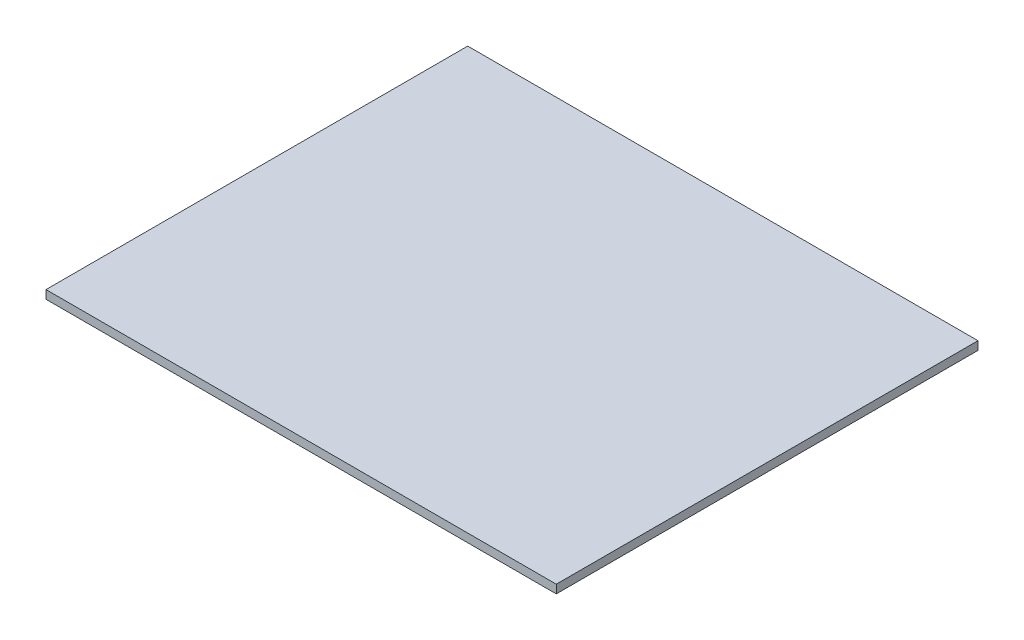
ISO-10303-21;
HEADER;
FILE_DESCRIPTION(('STEP AP214'),'2;1');
FILE_NAME('part.step','',(''),(''),'','','');
FILE_SCHEMA(('AUTOMOTIVE_DESIGN { 1 0 10303 214 1 1 1 1 }'));
ENDSEC;
DATA;
#1=APPLICATION_CONTEXT('core data for automotive mechanical design processes');
#2=APPLICATION_PROTOCOL_DEFINITION('international standard','automotive_design',2000,#1);
#3=PRODUCT_CONTEXT('',#1,'mechanical');
#4=PRODUCT('Part','Part','',(#3));
#5=PRODUCT_RELATED_PRODUCT_CATEGORY('part','',(#4));
#6=PRODUCT_DEFINITION_FORMATION('','',#4);
#7=PRODUCT_DEFINITION_CONTEXT('part definition',#1,'design');
#8=PRODUCT_DEFINITION('design','',#6,#7);
#9=PRODUCT_DEFINITION_SHAPE('','',#8);
#10=(LENGTH_UNIT() NAMED_UNIT(*) SI_UNIT(.MILLI.,.METRE.));
#11=(NAMED_UNIT(*) PLANE_ANGLE_UNIT() SI_UNIT($,.RADIAN.));
#12=(NAMED_UNIT(*) SI_UNIT($,.STERADIAN.) SOLID_ANGLE_UNIT());
#13=UNCERTAINTY_MEASURE_WITH_UNIT(LENGTH_MEASURE(1.E-05),#10,'distance_accuracy_value','');
#14=(GEOMETRIC_REPRESENTATION_CONTEXT(3) GLOBAL_UNCERTAINTY_ASSIGNED_CONTEXT((#13)) GLOBAL_UNIT_ASSIGNED_CONTEXT((#10,
#11,#12)) REPRESENTATION_CONTEXT('',''));
#15=CARTESIAN_POINT('',(0.,0.,0.));
#16=DIRECTION('',(0.,0.,1.));
#17=DIRECTION('',(1.,0.,0.));
#18=AXIS2_PLACEMENT_3D('',#15,#16,#17);
#19=CARTESIAN_POINT('',(-301.446567486664,-60.5,50.));
#20=DIRECTION('',(0.,-1.,0.));
#21=DIRECTION('',(0.,0.,-1.));
#22=AXIS2_PLACEMENT_3D('',#19,#20,#21);
#23=PLANE('',#22);
#24=DIRECTION('',(0.,0.,-1.));
#25=VECTOR('',#24,1.);
#26=CARTESIAN_POINT('',(60.5,-60.5,0.));
#27=LINE('',#26,#25);
#28=CARTESIAN_POINT('',(60.5,-60.5,50.));
#29=VERTEX_POINT('',#28);
#30=CARTESIAN_POINT('',(60.5,-60.5,-50.));
#31=VERTEX_POINT('',#30);
#32=EDGE_CURVE('E78',#29,#31,#27,.T.);
#33=ORIENTED_EDGE('',*,*,#32,.T.);
#34=DIRECTION('',(1.,0.,0.));
#35=VECTOR('',#34,1.);
#36=CARTESIAN_POINT('',(-62.5,-60.5,-50.));
#37=LINE('',#36,#35);
#38=CARTESIAN_POINT('',(-60.5,-60.5,-50.));
#39=VERTEX_POINT('',#38);
#40=EDGE_CURVE('E88',#39,#31,#37,.T.);
#41=ORIENTED_EDGE('',*,*,#40,.F.);
#42=DIRECTION('',(0.,0.,1.));
#43=VECTOR('',#42,1.);
#44=CARTESIAN_POINT('',(-60.5,-60.5,0.));
#45=LINE('',#44,#43);
#46=CARTESIAN_POINT('',(-60.5,-60.5,50.));
#47=VERTEX_POINT('',#46);
#48=EDGE_CURVE('E87',#39,#47,#45,.T.);
#49=ORIENTED_EDGE('',*,*,#48,.T.);
#50=DIRECTION('',(-1.,0.,0.));
#51=VECTOR('',#50,1.);
#52=CARTESIAN_POINT('',(-62.5,-60.5,50.));
#53=LINE('',#52,#51);
#54=EDGE_CURVE('E90',#29,#47,#53,.T.);
#55=ORIENTED_EDGE('',*,*,#54,.F.);
#56=EDGE_LOOP('',(#33,#41,#49,#55));
#57=FACE_BOUND('',#56,.T.);
#58=ADVANCED_FACE('F34',(#57),#23,.F.);
#59=CARTESIAN_POINT('',(0.,-62.5,0.));
#60=DIRECTION('',(0.,-1.,0.));
#61=DIRECTION('',(0.,0.,-1.));
#62=AXIS2_PLACEMENT_3D('',#59,#60,#61);
#63=PLANE('',#62);
#64=DIRECTION('',(0.,0.,1.));
#65=VECTOR('',#64,1.);
#66=CARTESIAN_POINT('',(-60.5,-62.5,0.));
#67=LINE('',#66,#65);
#68=CARTESIAN_POINT('',(-60.5,-62.5,-50.));
#69=VERTEX_POINT('',#68);
#70=CARTESIAN_POINT('',(-60.5,-62.5,50.));
#71=VERTEX_POINT('',#70);
#72=EDGE_CURVE('E44',#69,#71,#67,.T.);
#73=ORIENTED_EDGE('',*,*,#72,.F.);
#74=DIRECTION('',(-1.,0.,0.));
#75=VECTOR('',#74,1.);
#76=CARTESIAN_POINT('',(-62.5,-62.5,-50.));
#77=LINE('',#76,#75);
#78=CARTESIAN_POINT('',(60.5,-62.5,-50.));
#79=VERTEX_POINT('',#78);
#80=EDGE_CURVE('E95',#79,#69,#77,.T.);
#81=ORIENTED_EDGE('',*,*,#80,.F.);
#82=DIRECTION('',(0.,0.,-1.));
#83=VECTOR('',#82,1.);
#84=CARTESIAN_POINT('',(60.5,-62.5,0.));
#85=LINE('',#84,#83);
#86=CARTESIAN_POINT('',(60.5,-62.5,50.));
#87=VERTEX_POINT('',#86);
#88=EDGE_CURVE('E11',#87,#79,#85,.T.);
#89=ORIENTED_EDGE('',*,*,#88,.F.);
#90=DIRECTION('',(1.,0.,0.));
#91=VECTOR('',#90,1.);
#92=CARTESIAN_POINT('',(-62.5,-62.5,50.));
#93=LINE('',#92,#91);
#94=EDGE_CURVE('E93',#71,#87,#93,.T.);
#95=ORIENTED_EDGE('',*,*,#94,.F.);
#96=EDGE_LOOP('',(#73,#81,#89,#95));
#97=FACE_BOUND('',#96,.T.);
#98=ADVANCED_FACE('F106',(#97),#63,.T.);
#99=CARTESIAN_POINT('',(60.5,62.5,-133.832293437024));
#100=DIRECTION('',(-1.,0.,0.));
#101=DIRECTION('',(0.,0.,1.));
#102=AXIS2_PLACEMENT_3D('',#99,#100,#101);
#103=PLANE('',#102);
#104=DIRECTION('',(0.,-1.,0.));
#105=VECTOR('',#104,1.);
#106=CARTESIAN_POINT('',(60.5,62.5,-50.));
#107=LINE('',#106,#105);
#108=EDGE_CURVE('E83',#31,#79,#107,.T.);
#109=ORIENTED_EDGE('',*,*,#108,.F.);
#110=ORIENTED_EDGE('',*,*,#32,.F.);
#111=DIRECTION('',(0.,1.,0.));
#112=VECTOR('',#111,1.);
#113=CARTESIAN_POINT('',(60.5,62.5,50.));
#114=LINE('',#113,#112);
#115=EDGE_CURVE('E82',#87,#29,#114,.T.);
#116=ORIENTED_EDGE('',*,*,#115,.F.);
#117=ORIENTED_EDGE('',*,*,#88,.T.);
#118=EDGE_LOOP('',(#109,#110,#116,#117));
#119=FACE_BOUND('',#118,.T.);
#120=ADVANCED_FACE('F80',(#119),#103,.F.);
#121=CARTESIAN_POINT('',(-60.5,62.5,-133.832293437024));
#122=DIRECTION('',(1.,0.,0.));
#123=DIRECTION('',(0.,0.,-1.));
#124=AXIS2_PLACEMENT_3D('',#121,#122,#123);
#125=PLANE('',#124);
#126=DIRECTION('',(0.,-1.,0.));
#127=VECTOR('',#126,1.);
#128=CARTESIAN_POINT('',(-60.5,62.5,50.));
#129=LINE('',#128,#127);
#130=EDGE_CURVE('E38',#47,#71,#129,.T.);
#131=ORIENTED_EDGE('',*,*,#130,.F.);
#132=ORIENTED_EDGE('',*,*,#48,.F.);
#133=DIRECTION('',(0.,1.,0.));
#134=VECTOR('',#133,1.);
#135=CARTESIAN_POINT('',(-60.5,62.5,-50.));
#136=LINE('',#135,#134);
#137=EDGE_CURVE('E101',#69,#39,#136,.T.);
#138=ORIENTED_EDGE('',*,*,#137,.F.);
#139=ORIENTED_EDGE('',*,*,#72,.T.);
#140=EDGE_LOOP('',(#131,#132,#138,#139));
#141=FACE_BOUND('',#140,.T.);
#142=ADVANCED_FACE('F112',(#141),#125,.F.);
#143=CARTESIAN_POINT('',(-62.5,62.5,-50.));
#144=DIRECTION('',(0.,0.,1.));
#145=DIRECTION('',(1.,0.,0.));
#146=AXIS2_PLACEMENT_3D('',#143,#144,#145);
#147=PLANE('',#146);
#148=ORIENTED_EDGE('',*,*,#137,.T.);
#149=ORIENTED_EDGE('',*,*,#40,.T.);
#150=ORIENTED_EDGE('',*,*,#108,.T.);
#151=ORIENTED_EDGE('',*,*,#80,.T.);
#152=EDGE_LOOP('',(#148,#149,#150,#151));
#153=FACE_BOUND('',#152,.T.);
#154=ADVANCED_FACE('F36',(#153),#147,.F.);
#155=CARTESIAN_POINT('',(-62.5,62.5,50.));
#156=DIRECTION('',(0.,0.,-1.));
#157=DIRECTION('',(-1.,0.,0.));
#158=AXIS2_PLACEMENT_3D('',#155,#156,#157);
#159=PLANE('',#158);
#160=ORIENTED_EDGE('',*,*,#115,.T.);
#161=ORIENTED_EDGE('',*,*,#54,.T.);
#162=ORIENTED_EDGE('',*,*,#130,.T.);
#163=ORIENTED_EDGE('',*,*,#94,.T.);
#164=EDGE_LOOP('',(#160,#161,#162,#163));
#165=FACE_BOUND('',#164,.T.);
#166=ADVANCED_FACE('F92',(#165),#159,.F.);
#167=CLOSED_SHELL('',(#58,#98,#120,#142,#154,#166));
#168=MANIFOLD_SOLID_BREP('B2',#167);
#169=ADVANCED_BREP_SHAPE_REPRESENTATION('',(#18,#168),#14);
#170=SHAPE_DEFINITION_REPRESENTATION(#9,#169);
ENDSEC;
END-ISO-10303-21;
